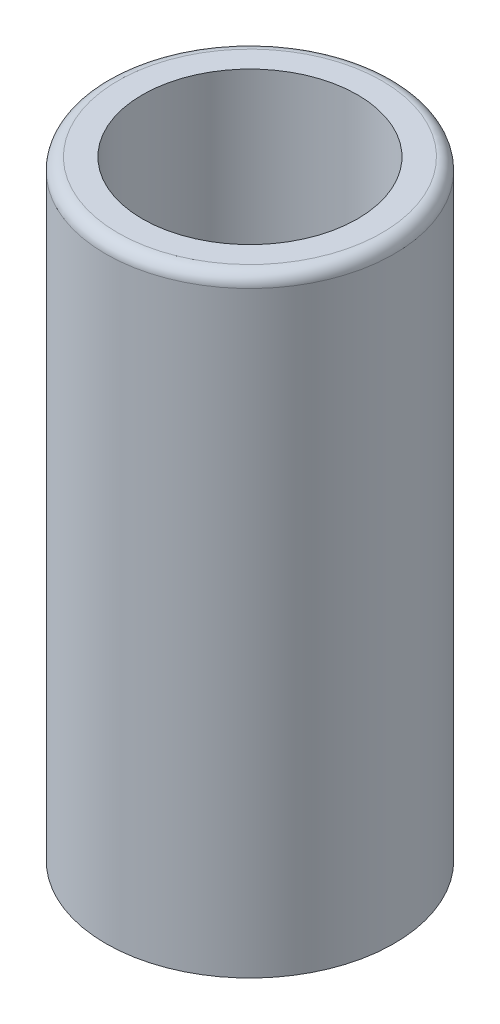
ISO-10303-21;
HEADER;
FILE_DESCRIPTION(('STEP AP214'),'2;1');
FILE_NAME('part.step','',(''),(''),'','','');
FILE_SCHEMA(('AUTOMOTIVE_DESIGN { 1 0 10303 214 1 1 1 1 }'));
ENDSEC;
DATA;
#1=APPLICATION_CONTEXT('core data for automotive mechanical design processes');
#2=APPLICATION_PROTOCOL_DEFINITION('international standard','automotive_design',2000,#1);
#3=PRODUCT_CONTEXT('',#1,'mechanical');
#4=PRODUCT('Part','Part','',(#3));
#5=PRODUCT_RELATED_PRODUCT_CATEGORY('part','',(#4));
#6=PRODUCT_DEFINITION_FORMATION('','',#4);
#7=PRODUCT_DEFINITION_CONTEXT('part definition',#1,'design');
#8=PRODUCT_DEFINITION('design','',#6,#7);
#9=PRODUCT_DEFINITION_SHAPE('','',#8);
#10=(LENGTH_UNIT() NAMED_UNIT(*) SI_UNIT(.MILLI.,.METRE.));
#11=(NAMED_UNIT(*) PLANE_ANGLE_UNIT() SI_UNIT($,.RADIAN.));
#12=(NAMED_UNIT(*) SI_UNIT($,.STERADIAN.) SOLID_ANGLE_UNIT());
#13=UNCERTAINTY_MEASURE_WITH_UNIT(LENGTH_MEASURE(1.E-05),#10,'distance_accuracy_value','');
#14=(GEOMETRIC_REPRESENTATION_CONTEXT(3) GLOBAL_UNCERTAINTY_ASSIGNED_CONTEXT((#13)) GLOBAL_UNIT_ASSIGNED_CONTEXT((#10,
#11,#12)) REPRESENTATION_CONTEXT('',''));
#15=CARTESIAN_POINT('',(0.,0.,0.));
#16=DIRECTION('',(0.,0.,1.));
#17=DIRECTION('',(1.,0.,0.));
#18=AXIS2_PLACEMENT_3D('',#15,#16,#17);
#19=CARTESIAN_POINT('',(0.,50.,0.));
#20=DIRECTION('',(0.,-1.,0.));
#21=DIRECTION('',(0.,0.,-1.));
#22=AXIS2_PLACEMENT_3D('',#19,#20,#21);
#23=CYLINDRICAL_SURFACE('',#22,11.825);
#24=CARTESIAN_POINT('',(0.,49.,0.));
#25=DIRECTION('',(0.,1.,0.));
#26=DIRECTION('',(0.,0.,1.));
#27=AXIS2_PLACEMENT_3D('',#24,#25,#26);
#28=CIRCLE('',#27,11.825);
#29=CARTESIAN_POINT('',(0.,49.,11.825));
#30=VERTEX_POINT('',#29);
#31=EDGE_CURVE('E10',#30,#30,#28,.F.);
#32=ORIENTED_EDGE('',*,*,#31,.T.);
#33=EDGE_LOOP('',(#32));
#34=FACE_BOUND('',#33,.T.);
#35=CARTESIAN_POINT('',(0.,0.,0.));
#36=DIRECTION('',(0.,1.,0.));
#37=DIRECTION('',(0.,0.,1.));
#38=AXIS2_PLACEMENT_3D('',#35,#36,#37);
#39=CIRCLE('',#38,11.825);
#40=CARTESIAN_POINT('',(0.,0.,11.825));
#41=VERTEX_POINT('',#40);
#42=EDGE_CURVE('E42',#41,#41,#39,.T.);
#43=ORIENTED_EDGE('',*,*,#42,.T.);
#44=EDGE_LOOP('',(#43));
#45=FACE_BOUND('',#44,.T.);
#46=ADVANCED_FACE('F31',(#34,#45),#23,.T.);
#47=CARTESIAN_POINT('',(0.,50.,0.));
#48=DIRECTION('',(0.,1.,0.));
#49=DIRECTION('',(0.,0.,1.));
#50=AXIS2_PLACEMENT_3D('',#47,#48,#49);
#51=PLANE('',#50);
#52=CARTESIAN_POINT('',(0.,50.,0.));
#53=DIRECTION('',(0.,1.,0.));
#54=DIRECTION('',(0.,0.,1.));
#55=AXIS2_PLACEMENT_3D('',#52,#53,#54);
#56=CIRCLE('',#55,10.825);
#57=CARTESIAN_POINT('',(0.,50.,10.825));
#58=VERTEX_POINT('',#57);
#59=EDGE_CURVE('E38',#58,#58,#56,.T.);
#60=ORIENTED_EDGE('',*,*,#59,.T.);
#61=EDGE_LOOP('',(#60));
#62=FACE_BOUND('',#61,.T.);
#63=CARTESIAN_POINT('',(0.,50.,0.));
#64=DIRECTION('',(0.,1.,0.));
#65=DIRECTION('',(0.,0.,1.));
#66=AXIS2_PLACEMENT_3D('',#63,#64,#65);
#67=CIRCLE('',#66,8.825);
#68=CARTESIAN_POINT('',(0.,50.,8.825));
#69=VERTEX_POINT('',#68);
#70=EDGE_CURVE('E49',#69,#69,#67,.T.);
#71=ORIENTED_EDGE('',*,*,#70,.F.);
#72=EDGE_LOOP('',(#71));
#73=FACE_BOUND('',#72,.T.);
#74=ADVANCED_FACE('F67',(#62,#73),#51,.T.);
#75=CARTESIAN_POINT('',(0.,0.,0.));
#76=DIRECTION('',(0.,1.,0.));
#77=DIRECTION('',(0.,0.,1.));
#78=AXIS2_PLACEMENT_3D('',#75,#76,#77);
#79=PLANE('',#78);
#80=CARTESIAN_POINT('',(0.,0.,0.));
#81=DIRECTION('',(0.,-1.,0.));
#82=DIRECTION('',(0.,0.,-1.));
#83=AXIS2_PLACEMENT_3D('',#80,#81,#82);
#84=CIRCLE('',#83,0.795);
#85=CARTESIAN_POINT('',(0.,0.,-0.795));
#86=VERTEX_POINT('',#85);
#87=EDGE_CURVE('E52',#86,#86,#84,.T.);
#88=ORIENTED_EDGE('',*,*,#87,.F.);
#89=EDGE_LOOP('',(#88));
#90=FACE_BOUND('',#89,.T.);
#91=ORIENTED_EDGE('',*,*,#42,.F.);
#92=EDGE_LOOP('',(#91));
#93=FACE_BOUND('',#92,.T.);
#94=ADVANCED_FACE('F63',(#90,#93),#79,.F.);
#95=CARTESIAN_POINT('',(0.,34.5,0.));
#96=DIRECTION('',(0.,1.,0.));
#97=DIRECTION('',(0.,0.,1.));
#98=AXIS2_PLACEMENT_3D('',#95,#96,#97);
#99=CYLINDRICAL_SURFACE('',#98,8.825);
#100=CARTESIAN_POINT('',(0.,34.5,0.));
#101=DIRECTION('',(0.,1.,0.));
#102=DIRECTION('',(0.,0.,1.));
#103=AXIS2_PLACEMENT_3D('',#100,#101,#102);
#104=CIRCLE('',#103,8.825);
#105=CARTESIAN_POINT('',(0.,34.5,8.825));
#106=VERTEX_POINT('',#105);
#107=EDGE_CURVE('E46',#106,#106,#104,.T.);
#108=ORIENTED_EDGE('',*,*,#107,.F.);
#109=EDGE_LOOP('',(#108));
#110=FACE_BOUND('',#109,.T.);
#111=ORIENTED_EDGE('',*,*,#70,.T.);
#112=EDGE_LOOP('',(#111));
#113=FACE_BOUND('',#112,.T.);
#114=ADVANCED_FACE('F66',(#110,#113),#99,.F.);
#115=CARTESIAN_POINT('',(0.,34.5,0.));
#116=DIRECTION('',(0.,1.,0.));
#117=DIRECTION('',(0.,0.,1.));
#118=AXIS2_PLACEMENT_3D('',#115,#116,#117);
#119=PLANE('',#118);
#120=CARTESIAN_POINT('',(0.,34.5,0.));
#121=DIRECTION('',(0.,1.,0.));
#122=DIRECTION('',(0.,0.,1.));
#123=AXIS2_PLACEMENT_3D('',#120,#121,#122);
#124=CIRCLE('',#123,0.795);
#125=CARTESIAN_POINT('',(0.,34.5,0.795));
#126=VERTEX_POINT('',#125);
#127=EDGE_CURVE('E55',#126,#126,#124,.F.);
#128=ORIENTED_EDGE('',*,*,#127,.T.);
#129=EDGE_LOOP('',(#128));
#130=FACE_BOUND('',#129,.T.);
#131=ORIENTED_EDGE('',*,*,#107,.T.);
#132=EDGE_LOOP('',(#131));
#133=FACE_BOUND('',#132,.T.);
#134=ADVANCED_FACE('F79',(#130,#133),#119,.T.);
#135=CARTESIAN_POINT('',(0.,49.,0.));
#136=DIRECTION('',(0.,1.,0.));
#137=DIRECTION('',(0.,0.,1.));
#138=AXIS2_PLACEMENT_3D('',#135,#136,#137);
#139=TOROIDAL_SURFACE('',#138,10.825,1.);
#140=ORIENTED_EDGE('',*,*,#31,.F.);
#141=EDGE_LOOP('',(#140));
#142=FACE_BOUND('',#141,.T.);
#143=ORIENTED_EDGE('',*,*,#59,.F.);
#144=EDGE_LOOP('',(#143));
#145=FACE_BOUND('',#144,.T.);
#146=ADVANCED_FACE('F33',(#142,#145),#139,.T.);
#147=CARTESIAN_POINT('',(0.,50.001,0.));
#148=DIRECTION('',(0.,-1.,0.));
#149=DIRECTION('',(0.,0.,-1.));
#150=AXIS2_PLACEMENT_3D('',#147,#148,#149);
#151=CYLINDRICAL_SURFACE('',#150,0.795);
#152=ORIENTED_EDGE('',*,*,#127,.F.);
#153=EDGE_LOOP('',(#152));
#154=FACE_BOUND('',#153,.T.);
#155=ORIENTED_EDGE('',*,*,#87,.T.);
#156=EDGE_LOOP('',(#155));
#157=FACE_BOUND('',#156,.T.);
#158=ADVANCED_FACE('F61',(#154,#157),#151,.F.);
#159=CLOSED_SHELL('',(#46,#74,#94,#114,#134,#146,#158));
#160=MANIFOLD_SOLID_BREP('B2',#159);
#161=ADVANCED_BREP_SHAPE_REPRESENTATION('',(#18,#160),#14);
#162=SHAPE_DEFINITION_REPRESENTATION(#9,#161);
ENDSEC;
END-ISO-10303-21;
